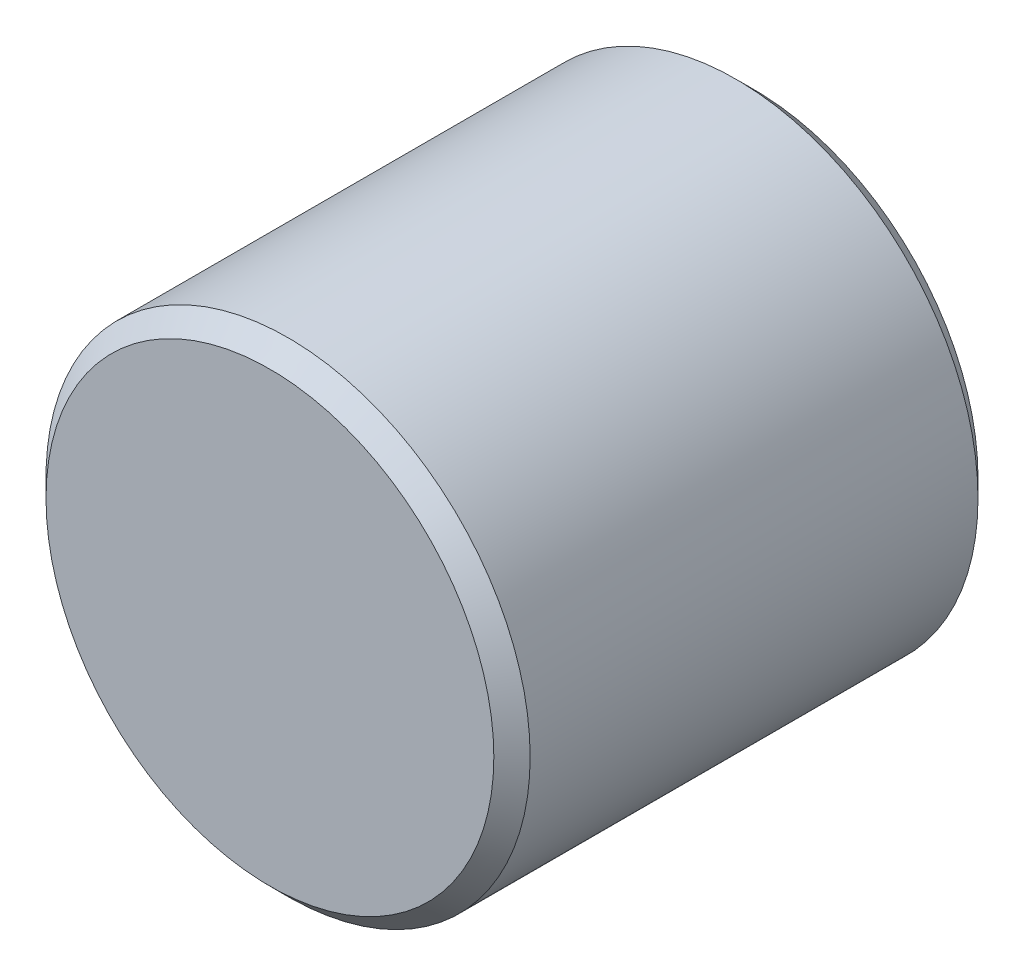
ISO-10303-21;
HEADER;
FILE_DESCRIPTION(('STEP AP214'),'2;1');
FILE_NAME('part.step','',(''),(''),'','','');
FILE_SCHEMA(('AUTOMOTIVE_DESIGN { 1 0 10303 214 1 1 1 1 }'));
ENDSEC;
DATA;
#1=APPLICATION_CONTEXT('core data for automotive mechanical design processes');
#2=APPLICATION_PROTOCOL_DEFINITION('international standard','automotive_design',2000,#1);
#3=PRODUCT_CONTEXT('',#1,'mechanical');
#4=PRODUCT('Part','Part','',(#3));
#5=PRODUCT_RELATED_PRODUCT_CATEGORY('part','',(#4));
#6=PRODUCT_DEFINITION_FORMATION('','',#4);
#7=PRODUCT_DEFINITION_CONTEXT('part definition',#1,'design');
#8=PRODUCT_DEFINITION('design','',#6,#7);
#9=PRODUCT_DEFINITION_SHAPE('','',#8);
#10=(LENGTH_UNIT() NAMED_UNIT(*) SI_UNIT(.MILLI.,.METRE.));
#11=(NAMED_UNIT(*) PLANE_ANGLE_UNIT() SI_UNIT($,.RADIAN.));
#12=(NAMED_UNIT(*) SI_UNIT($,.STERADIAN.) SOLID_ANGLE_UNIT());
#13=UNCERTAINTY_MEASURE_WITH_UNIT(LENGTH_MEASURE(1.E-05),#10,'distance_accuracy_value','');
#14=(GEOMETRIC_REPRESENTATION_CONTEXT(3) GLOBAL_UNCERTAINTY_ASSIGNED_CONTEXT((#13)) GLOBAL_UNIT_ASSIGNED_CONTEXT((#10,
#11,#12)) REPRESENTATION_CONTEXT('',''));
#15=CARTESIAN_POINT('',(0.,0.,0.));
#16=DIRECTION('',(0.,0.,1.));
#17=DIRECTION('',(1.,0.,0.));
#18=AXIS2_PLACEMENT_3D('',#15,#16,#17);
#19=CARTESIAN_POINT('',(0.,0.,8.));
#20=DIRECTION('',(0.,0.,-1.));
#21=DIRECTION('',(-1.,0.,0.));
#22=AXIS2_PLACEMENT_3D('',#19,#20,#21);
#23=CYLINDRICAL_SURFACE('',#22,4.);
#24=CARTESIAN_POINT('',(0.,0.,0.300000000000001));
#25=DIRECTION('',(0.,0.,1.));
#26=DIRECTION('',(1.,0.,0.));
#27=AXIS2_PLACEMENT_3D('',#24,#25,#26);
#28=CIRCLE('',#27,4.);
#29=CARTESIAN_POINT('',(4.,0.,0.300000000000001));
#30=VERTEX_POINT('',#29);
#31=EDGE_CURVE('E48',#30,#30,#28,.T.);
#32=ORIENTED_EDGE('',*,*,#31,.T.);
#33=EDGE_LOOP('',(#32));
#34=FACE_BOUND('',#33,.T.);
#35=CARTESIAN_POINT('',(0.,0.,7.7));
#36=DIRECTION('',(0.,0.,1.));
#37=DIRECTION('',(1.,0.,0.));
#38=AXIS2_PLACEMENT_3D('',#35,#36,#37);
#39=CIRCLE('',#38,4.);
#40=CARTESIAN_POINT('',(4.,0.,7.7));
#41=VERTEX_POINT('',#40);
#42=EDGE_CURVE('E52',#41,#41,#39,.F.);
#43=ORIENTED_EDGE('',*,*,#42,.T.);
#44=EDGE_LOOP('',(#43));
#45=FACE_BOUND('',#44,.T.);
#46=ADVANCED_FACE('F37',(#34,#45),#23,.T.);
#47=CARTESIAN_POINT('',(0.,0.,8.));
#48=DIRECTION('',(0.,0.,1.));
#49=DIRECTION('',(1.,0.,0.));
#50=AXIS2_PLACEMENT_3D('',#47,#48,#49);
#51=PLANE('',#50);
#52=CARTESIAN_POINT('',(0.,0.,8.));
#53=DIRECTION('',(0.,0.,1.));
#54=DIRECTION('',(1.,0.,0.));
#55=AXIS2_PLACEMENT_3D('',#52,#53,#54);
#56=CIRCLE('',#55,3.7);
#57=CARTESIAN_POINT('',(3.7,0.,8.));
#58=VERTEX_POINT('',#57);
#59=EDGE_CURVE('E10',#58,#58,#56,.T.);
#60=ORIENTED_EDGE('',*,*,#59,.T.);
#61=EDGE_LOOP('',(#60));
#62=FACE_BOUND('',#61,.T.);
#63=ADVANCED_FACE('F68',(#62),#51,.T.);
#64=CARTESIAN_POINT('',(0.,0.,0.));
#65=DIRECTION('',(0.,0.,1.));
#66=DIRECTION('',(1.,0.,0.));
#67=AXIS2_PLACEMENT_3D('',#64,#65,#66);
#68=PLANE('',#67);
#69=CARTESIAN_POINT('',(0.,0.,0.));
#70=DIRECTION('',(0.,0.,1.));
#71=DIRECTION('',(1.,0.,0.));
#72=AXIS2_PLACEMENT_3D('',#69,#70,#71);
#73=CIRCLE('',#72,3.7);
#74=CARTESIAN_POINT('',(3.7,0.,0.));
#75=VERTEX_POINT('',#74);
#76=EDGE_CURVE('E44',#75,#75,#73,.F.);
#77=ORIENTED_EDGE('',*,*,#76,.T.);
#78=EDGE_LOOP('',(#77));
#79=FACE_BOUND('',#78,.T.);
#80=ADVANCED_FACE('F65',(#79),#68,.F.);
#81=CARTESIAN_POINT('',(0.,0.,0.300000000000001));
#82=DIRECTION('',(0.,0.,1.));
#83=DIRECTION('',(1.,0.,0.));
#84=AXIS2_PLACEMENT_3D('',#81,#82,#83);
#85=CONICAL_SURFACE('',#84,4.,0.785398163397451);
#86=CARTESIAN_POINT('',(3.7,0.,0.));
#87=CARTESIAN_POINT('',(3.703125,0.,0.00312500000000003));
#88=CARTESIAN_POINT('',(3.70625,0.,0.00625000000000004));
#89=CARTESIAN_POINT('',(3.7125,0.,0.0125));
#90=CARTESIAN_POINT('',(3.715625,0.,0.015625));
#91=CARTESIAN_POINT('',(3.721875,0.,0.021875));
#92=CARTESIAN_POINT('',(3.725,0.,0.025));
#93=CARTESIAN_POINT('',(3.73125,0.,0.03125));
#94=CARTESIAN_POINT('',(3.734375,0.,0.0343750000000001));
#95=CARTESIAN_POINT('',(3.740625,0.,0.0406250000000001));
#96=CARTESIAN_POINT('',(3.74375,0.,0.04375));
#97=CARTESIAN_POINT('',(3.75,0.,0.0500000000000001));
#98=CARTESIAN_POINT('',(3.753125,0.,0.0531250000000001));
#99=CARTESIAN_POINT('',(3.759375,0.,0.0593750000000001));
#100=CARTESIAN_POINT('',(3.7625,0.,0.0625000000000001));
#101=CARTESIAN_POINT('',(3.76875,0.,0.0687500000000001));
#102=CARTESIAN_POINT('',(3.771875,0.,0.0718750000000001));
#103=CARTESIAN_POINT('',(3.778125,0.,0.0781250000000002));
#104=CARTESIAN_POINT('',(3.78125,0.,0.0812500000000002));
#105=CARTESIAN_POINT('',(3.7875,0.,0.0875000000000001));
#106=CARTESIAN_POINT('',(3.790625,0.,0.0906250000000001));
#107=CARTESIAN_POINT('',(3.796875,0.,0.0968750000000002));
#108=CARTESIAN_POINT('',(3.8,0.,0.1));
#109=CARTESIAN_POINT('',(3.80625,0.,0.10625));
#110=CARTESIAN_POINT('',(3.809375,0.,0.109375));
#111=CARTESIAN_POINT('',(3.815625,0.,0.115625));
#112=CARTESIAN_POINT('',(3.81875,0.,0.11875));
#113=CARTESIAN_POINT('',(3.825,0.,0.125));
#114=CARTESIAN_POINT('',(3.828125,0.,0.128125));
#115=CARTESIAN_POINT('',(3.834375,0.,0.134375));
#116=CARTESIAN_POINT('',(3.8375,0.,0.1375));
#117=CARTESIAN_POINT('',(3.84375,0.,0.14375));
#118=CARTESIAN_POINT('',(3.846875,0.,0.146875));
#119=CARTESIAN_POINT('',(3.853125,0.,0.153125));
#120=CARTESIAN_POINT('',(3.85625,0.,0.15625));
#121=CARTESIAN_POINT('',(3.8625,0.,0.1625));
#122=CARTESIAN_POINT('',(3.865625,0.,0.165625));
#123=CARTESIAN_POINT('',(3.871875,0.,0.171875));
#124=CARTESIAN_POINT('',(3.875,0.,0.175));
#125=CARTESIAN_POINT('',(3.88125,0.,0.18125));
#126=CARTESIAN_POINT('',(3.884375,0.,0.184375));
#127=CARTESIAN_POINT('',(3.890625,0.,0.190625));
#128=CARTESIAN_POINT('',(3.89375,0.,0.19375));
#129=CARTESIAN_POINT('',(3.9,0.,0.2));
#130=CARTESIAN_POINT('',(3.903125,0.,0.203125));
#131=CARTESIAN_POINT('',(3.909375,0.,0.209375000000001));
#132=CARTESIAN_POINT('',(3.9125,0.,0.212500000000001));
#133=CARTESIAN_POINT('',(3.91875,0.,0.218750000000001));
#134=CARTESIAN_POINT('',(3.921875,0.,0.221875));
#135=CARTESIAN_POINT('',(3.928125,0.,0.228125));
#136=CARTESIAN_POINT('',(3.93125,0.,0.231250000000001));
#137=CARTESIAN_POINT('',(3.9375,0.,0.237500000000001));
#138=CARTESIAN_POINT('',(3.940625,0.,0.240625000000001));
#139=CARTESIAN_POINT('',(3.946875,0.,0.246875000000001));
#140=CARTESIAN_POINT('',(3.95,0.,0.250000000000001));
#141=CARTESIAN_POINT('',(3.95625,0.,0.256250000000001));
#142=CARTESIAN_POINT('',(3.959375,0.,0.259375000000001));
#143=CARTESIAN_POINT('',(3.965625,0.,0.265625000000001));
#144=CARTESIAN_POINT('',(3.96875,0.,0.268750000000001));
#145=CARTESIAN_POINT('',(3.975,0.,0.275000000000001));
#146=CARTESIAN_POINT('',(3.978125,0.,0.278125000000001));
#147=CARTESIAN_POINT('',(3.984375,0.,0.284375000000001));
#148=CARTESIAN_POINT('',(3.9875,0.,0.287500000000001));
#149=CARTESIAN_POINT('',(3.99375,0.,0.293750000000001));
#150=CARTESIAN_POINT('',(3.996875,0.,0.296875));
#151=CARTESIAN_POINT('',(4.,0.,0.300000000000001));
#152=B_SPLINE_CURVE_WITH_KNOTS('',3,(#86,#87,#88,#89,#90,#91,#92,#93,#94,#95,#96,#97,#98,#99,
#100,#101,#102,#103,#104,#105,#106,#107,#108,#109,#110,#111,#112,#113,#114,#115,#116,#117,#118,
#119,#120,#121,#122,#123,#124,#125,#126,#127,#128,#129,#130,#131,#132,#133,#134,#135,#136,#137,
#138,#139,#140,#141,#142,#143,#144,#145,#146,#147,#148,#149,#150,#151),.UNSPECIFIED.,.F.,.F.,(4,
2,2,2,2,2,2,2,2,2,2,2,2,2,2,2,2,2,2,2,2,2,2,2,2,2,2,2,2,2,2,2,4),(0.,0.0132582521472477,
0.0265165042944956,0.0397747564417436,0.0530330085889913,0.0662912607362393,0.0795495128834869,
0.0928077650307349,0.106066017177983,0.119324269325231,0.132582521472478,0.145840773619726,
0.159099025766974,0.172357277914222,0.18561553006147,0.198873782208717,0.212132034355965,
0.225390286503213,0.238648538650461,0.251906790797709,0.265165042944957,0.278423295092205,
0.291681547239452,0.3049397993867,0.318198051533948,0.331456303681196,0.344714555828444,
0.357972807975692,0.37123106012294,0.384489312270187,0.397747564417435,0.411005816564683,
0.424264068711931),.UNSPECIFIED.);
#153=EDGE_CURVE('BSEAM61',#75,#30,#152,.T.);
#154=ORIENTED_EDGE('',*,*,#76,.F.);
#155=ORIENTED_EDGE('',*,*,#31,.F.);
#156=ORIENTED_EDGE('',*,*,#153,.T.);
#157=ORIENTED_EDGE('',*,*,#153,.F.);
#158=EDGE_LOOP('',(#154,#156,#155,#157));
#159=FACE_BOUND('',#158,.T.);
#160=ADVANCED_FACE('F61',(#159),#85,.T.);
#161=CARTESIAN_POINT('',(0.,0.,8.));
#162=DIRECTION('',(0.,0.,-1.));
#163=DIRECTION('',(-1.,0.,0.));
#164=AXIS2_PLACEMENT_3D('',#161,#162,#163);
#165=CONICAL_SURFACE('',#164,3.7,0.785398163397445);
#166=ORIENTED_EDGE('',*,*,#42,.F.);
#167=EDGE_LOOP('',(#166));
#168=FACE_BOUND('',#167,.T.);
#169=ORIENTED_EDGE('',*,*,#59,.F.);
#170=EDGE_LOOP('',(#169));
#171=FACE_BOUND('',#170,.T.);
#172=ADVANCED_FACE('F39',(#168,#171),#165,.T.);
#173=CLOSED_SHELL('',(#46,#63,#80,#160,#172));
#174=MANIFOLD_SOLID_BREP('B2',#173);
#175=ADVANCED_BREP_SHAPE_REPRESENTATION('',(#18,#174),#14);
#176=SHAPE_DEFINITION_REPRESENTATION(#9,#175);
ENDSEC;
END-ISO-10303-21;
